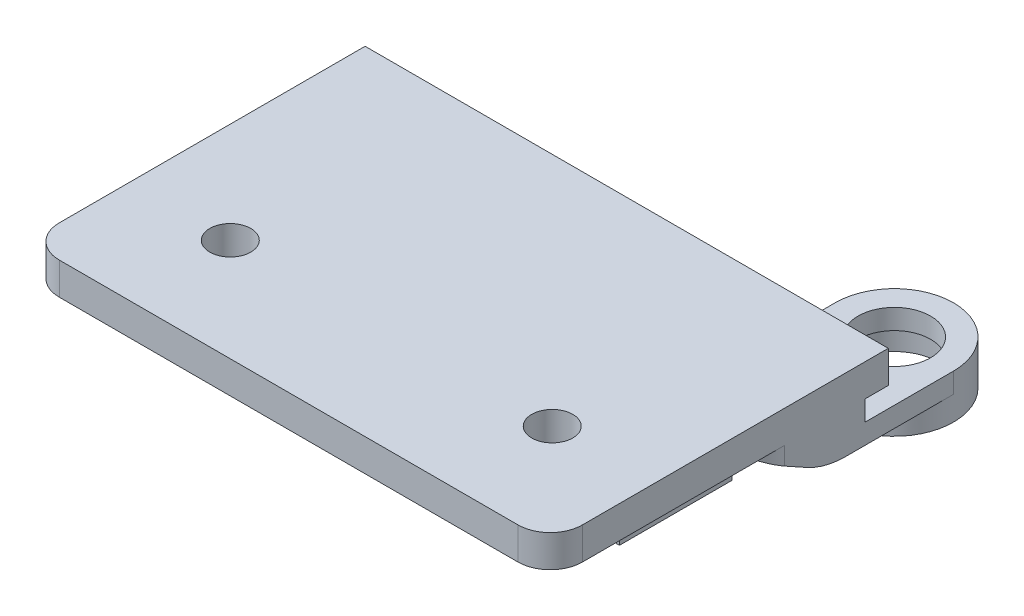
ISO-10303-21;
HEADER;
FILE_DESCRIPTION(('STEP AP214'),'2;1');
FILE_NAME('part.step','',(''),(''),'','','');
FILE_SCHEMA(('AUTOMOTIVE_DESIGN { 1 0 10303 214 1 1 1 1 }'));
ENDSEC;
DATA;
#1=APPLICATION_CONTEXT('core data for automotive mechanical design processes');
#2=APPLICATION_PROTOCOL_DEFINITION('international standard','automotive_design',2000,#1);
#3=PRODUCT_CONTEXT('',#1,'mechanical');
#4=PRODUCT('Part','Part','',(#3));
#5=PRODUCT_RELATED_PRODUCT_CATEGORY('part','',(#4));
#6=PRODUCT_DEFINITION_FORMATION('','',#4);
#7=PRODUCT_DEFINITION_CONTEXT('part definition',#1,'design');
#8=PRODUCT_DEFINITION('design','',#6,#7);
#9=PRODUCT_DEFINITION_SHAPE('','',#8);
#10=(LENGTH_UNIT() NAMED_UNIT(*) SI_UNIT(.MILLI.,.METRE.));
#11=(NAMED_UNIT(*) PLANE_ANGLE_UNIT() SI_UNIT($,.RADIAN.));
#12=(NAMED_UNIT(*) SI_UNIT($,.STERADIAN.) SOLID_ANGLE_UNIT());
#13=UNCERTAINTY_MEASURE_WITH_UNIT(LENGTH_MEASURE(1.E-05),#10,'distance_accuracy_value','');
#14=(GEOMETRIC_REPRESENTATION_CONTEXT(3) GLOBAL_UNCERTAINTY_ASSIGNED_CONTEXT((#13)) GLOBAL_UNIT_ASSIGNED_CONTEXT((#10,
#11,#12)) REPRESENTATION_CONTEXT('',''));
#15=CARTESIAN_POINT('',(0.,0.,0.));
#16=DIRECTION('',(0.,0.,1.));
#17=DIRECTION('',(1.,0.,0.));
#18=AXIS2_PLACEMENT_3D('',#15,#16,#17);
#19=CARTESIAN_POINT('',(45.4999999999992,33.,-32.1043329903239));
#20=DIRECTION('',(0.,-1.,0.));
#21=DIRECTION('',(0.,0.,1.));
#22=AXIS2_PLACEMENT_3D('',#19,#20,#21);
#23=PLANE('',#22);
#24=CARTESIAN_POINT('',(57.6499999999992,33.,-50.1043329903239));
#25=DIRECTION('',(0.,1.,0.));
#26=DIRECTION('',(0.,0.,1.));
#27=AXIS2_PLACEMENT_3D('',#24,#25,#26);
#28=CIRCLE('',#27,4.5);
#29=CARTESIAN_POINT('',(57.6499999999992,33.,-45.6043329903239));
#30=VERTEX_POINT('',#29);
#31=EDGE_CURVE('E1059',#30,#30,#28,.T.);
#32=ORIENTED_EDGE('',*,*,#31,.T.);
#33=EDGE_LOOP('',(#32));
#34=FACE_BOUND('',#33,.T.);
#35=CARTESIAN_POINT('',(57.6499999999992,33.,-50.1043329903239));
#36=DIRECTION('',(0.,1.,0.));
#37=DIRECTION('',(0.,0.,1.));
#38=AXIS2_PLACEMENT_3D('',#35,#36,#37);
#39=CIRCLE('',#38,5.55);
#40=CARTESIAN_POINT('',(57.6499999999992,33.,-44.5543329903239));
#41=VERTEX_POINT('',#40);
#42=EDGE_CURVE('E12',#41,#41,#39,.F.);
#43=ORIENTED_EDGE('',*,*,#42,.T.);
#44=EDGE_LOOP('',(#43));
#45=FACE_BOUND('',#44,.T.);
#46=ADVANCED_FACE('F54',(#34,#45),#23,.T.);
#47=CARTESIAN_POINT('',(20.1111633715986,6.43978022143896,-25.1043329903239));
#48=DIRECTION('',(-1.,0.,0.));
#49=DIRECTION('',(0.,0.,1.));
#50=AXIS2_PLACEMENT_3D('',#47,#48,#49);
#51=PLANE('',#50);
#52=DIRECTION('',(0.,1.,0.));
#53=VECTOR('',#52,1.);
#54=CARTESIAN_POINT('',(20.1111633715986,24.,-30.6043329903239));
#55=LINE('',#54,#53);
#56=CARTESIAN_POINT('',(20.1111633715986,24.,-30.6043329903239));
#57=VERTEX_POINT('',#56);
#58=CARTESIAN_POINT('',(20.1111633715986,28.,-30.6043329903239));
#59=VERTEX_POINT('',#58);
#60=EDGE_CURVE('E389',#57,#59,#55,.T.);
#61=ORIENTED_EDGE('',*,*,#60,.T.);
#62=DIRECTION('',(0.,0.,-1.));
#63=VECTOR('',#62,1.);
#64=CARTESIAN_POINT('',(20.1111633715986,28.,-30.6043329903239));
#65=LINE('',#64,#63);
#66=CARTESIAN_POINT('',(20.1111633715986,28.,-33.6043329903239));
#67=VERTEX_POINT('',#66);
#68=EDGE_CURVE('E401',#59,#67,#65,.T.);
#69=ORIENTED_EDGE('',*,*,#68,.T.);
#70=DIRECTION('',(0.,1.,0.));
#71=VECTOR('',#70,1.);
#72=CARTESIAN_POINT('',(20.1111633715986,24.,-33.6043329903239));
#73=LINE('',#72,#71);
#74=CARTESIAN_POINT('',(20.1111633715986,24.,-33.6043329903239));
#75=VERTEX_POINT('',#74);
#76=EDGE_CURVE('E382',#75,#67,#73,.T.);
#77=ORIENTED_EDGE('',*,*,#76,.F.);
#78=DIRECTION('',(0.,0.,-1.));
#79=VECTOR('',#78,1.);
#80=CARTESIAN_POINT('',(20.1111633715986,24.,-25.1043329903239));
#81=LINE('',#80,#79);
#82=CARTESIAN_POINT('',(20.1111633715986,24.,-39.1043329903239));
#83=VERTEX_POINT('',#82);
#84=EDGE_CURVE('E273',#75,#83,#81,.T.);
#85=ORIENTED_EDGE('',*,*,#84,.T.);
#86=DIRECTION('',(0.,1.,0.));
#87=VECTOR('',#86,1.);
#88=CARTESIAN_POINT('',(20.1111633715986,6.43978022143896,-39.1043329903239));
#89=LINE('',#88,#87);
#90=CARTESIAN_POINT('',(20.1111633715986,38.,-39.1043329903239));
#91=VERTEX_POINT('',#90);
#92=EDGE_CURVE('E282',#83,#91,#89,.T.);
#93=ORIENTED_EDGE('',*,*,#92,.T.);
#94=DIRECTION('',(0.,0.,-1.));
#95=VECTOR('',#94,1.);
#96=CARTESIAN_POINT('',(20.1111633715986,38.,-25.1043329903239));
#97=LINE('',#96,#95);
#98=CARTESIAN_POINT('',(20.1111633715986,38.,-25.1043329903239));
#99=VERTEX_POINT('',#98);
#100=EDGE_CURVE('E283',#99,#91,#97,.T.);
#101=ORIENTED_EDGE('',*,*,#100,.F.);
#102=DIRECTION('',(0.,1.,0.));
#103=VECTOR('',#102,1.);
#104=CARTESIAN_POINT('',(20.1111633715986,6.43978022143896,-25.1043329903239));
#105=LINE('',#104,#103);
#106=CARTESIAN_POINT('',(20.1111633715986,24.,-25.1043329903239));
#107=VERTEX_POINT('',#106);
#108=EDGE_CURVE('E286',#107,#99,#105,.T.);
#109=ORIENTED_EDGE('',*,*,#108,.F.);
#110=EDGE_CURVE('E269',#107,#57,#81,.T.);
#111=ORIENTED_EDGE('',*,*,#110,.T.);
#112=EDGE_LOOP('',(#61,#69,#77,#85,#93,#101,#109,#111));
#113=FACE_BOUND('',#112,.T.);
#114=ADVANCED_FACE('F504',(#113),#51,.F.);
#115=CARTESIAN_POINT('',(71.8178210632764,24.,-25.1043329903239));
#116=DIRECTION('',(0.,-1.,0.));
#117=DIRECTION('',(0.,0.,1.));
#118=AXIS2_PLACEMENT_3D('',#115,#116,#117);
#119=PLANE('',#118);
#120=CARTESIAN_POINT('',(35.4999999999992,24.,-32.1043329903239));
#121=DIRECTION('',(0.,1.,0.));
#122=DIRECTION('',(0.,0.,1.));
#123=AXIS2_PLACEMENT_3D('',#120,#121,#122);
#124=CIRCLE('',#123,2.);
#125=CARTESIAN_POINT('',(35.4999999999992,24.,-30.1043329903239));
#126=VERTEX_POINT('',#125);
#127=EDGE_CURVE('E380',#126,#126,#124,.T.);
#128=ORIENTED_EDGE('',*,*,#127,.F.);
#129=EDGE_LOOP('',(#128));
#130=FACE_BOUND('',#129,.T.);
#131=CARTESIAN_POINT('',(45.4999999999992,24.,-32.1043329903239));
#132=DIRECTION('',(0.,1.,0.));
#133=DIRECTION('',(0.,0.,1.));
#134=AXIS2_PLACEMENT_3D('',#131,#132,#133);
#135=CIRCLE('',#134,2.55);
#136=CARTESIAN_POINT('',(45.4999999999992,24.,-29.5543329903239));
#137=VERTEX_POINT('',#136);
#138=EDGE_CURVE('E268',#137,#137,#135,.F.);
#139=ORIENTED_EDGE('',*,*,#138,.T.);
#140=EDGE_LOOP('',(#139));
#141=FACE_BOUND('',#140,.T.);
#142=DIRECTION('',(-1.,0.,0.));
#143=VECTOR('',#142,1.);
#144=CARTESIAN_POINT('',(24.1111633715986,24.,-30.6043329903239));
#145=LINE('',#144,#143);
#146=CARTESIAN_POINT('',(24.1111633715986,24.,-30.6043329903239));
#147=VERTEX_POINT('',#146);
#148=EDGE_CURVE('E394',#147,#57,#145,.T.);
#149=ORIENTED_EDGE('',*,*,#148,.T.);
#150=ORIENTED_EDGE('',*,*,#110,.F.);
#151=DIRECTION('',(-1.,0.,0.));
#152=VECTOR('',#151,1.);
#153=CARTESIAN_POINT('',(71.8178210632764,24.,-25.1043329903239));
#154=LINE('',#153,#152);
#155=CARTESIAN_POINT('',(48.4999999999992,24.,-25.1043329903239));
#156=VERTEX_POINT('',#155);
#157=EDGE_CURVE('E274',#156,#107,#154,.T.);
#158=ORIENTED_EDGE('',*,*,#157,.F.);
#159=DIRECTION('',(0.,0.,-1.));
#160=VECTOR('',#159,1.);
#161=CARTESIAN_POINT('',(48.4999999999992,24.,-25.1043329903239));
#162=LINE('',#161,#160);
#163=CARTESIAN_POINT('',(48.4999999999992,24.,-39.1043329903239));
#164=VERTEX_POINT('',#163);
#165=EDGE_CURVE('E405',#156,#164,#162,.T.);
#166=ORIENTED_EDGE('',*,*,#165,.T.);
#167=DIRECTION('',(-1.,0.,0.));
#168=VECTOR('',#167,1.);
#169=CARTESIAN_POINT('',(71.8178210632764,24.,-39.1043329903239));
#170=LINE('',#169,#168);
#171=EDGE_CURVE('E272',#164,#83,#170,.T.);
#172=ORIENTED_EDGE('',*,*,#171,.T.);
#173=ORIENTED_EDGE('',*,*,#84,.F.);
#174=DIRECTION('',(-1.,0.,0.));
#175=VECTOR('',#174,1.);
#176=CARTESIAN_POINT('',(24.1111633715986,24.,-33.6043329903239));
#177=LINE('',#176,#175);
#178=CARTESIAN_POINT('',(24.1111633715986,24.,-33.6043329903239));
#179=VERTEX_POINT('',#178);
#180=EDGE_CURVE('E69',#179,#75,#177,.T.);
#181=ORIENTED_EDGE('',*,*,#180,.F.);
#182=DIRECTION('',(0.,0.,-1.));
#183=VECTOR('',#182,1.);
#184=CARTESIAN_POINT('',(24.1111633715986,24.,-30.6043329903239));
#185=LINE('',#184,#183);
#186=EDGE_CURVE('E395',#147,#179,#185,.T.);
#187=ORIENTED_EDGE('',*,*,#186,.F.);
#188=EDGE_LOOP('',(#149,#150,#158,#166,#172,#173,#181,#187));
#189=FACE_BOUND('',#188,.T.);
#190=ADVANCED_FACE('F510',(#130,#141,#189),#119,.F.);
#191=CARTESIAN_POINT('',(4.,38.,-4.));
#192=DIRECTION('',(0.,-1.,0.));
#193=DIRECTION('',(0.,0.,1.));
#194=AXIS2_PLACEMENT_3D('',#191,#192,#193);
#195=PLANE('',#194);
#196=CARTESIAN_POINT('',(35.4999999999992,38.,-32.1043329903239));
#197=DIRECTION('',(0.,1.,0.));
#198=DIRECTION('',(0.,0.,1.));
#199=AXIS2_PLACEMENT_3D('',#196,#197,#198);
#200=CIRCLE('',#199,2.);
#201=CARTESIAN_POINT('',(35.4999999999992,38.,-30.1043329903239));
#202=VERTEX_POINT('',#201);
#203=EDGE_CURVE('E62',#202,#202,#200,.T.);
#204=ORIENTED_EDGE('',*,*,#203,.T.);
#205=EDGE_LOOP('',(#204));
#206=FACE_BOUND('',#205,.T.);
#207=DIRECTION('',(1.,0.,0.));
#208=VECTOR('',#207,1.);
#209=CARTESIAN_POINT('',(16.1111633715986,38.,-25.1043329903239));
#210=LINE('',#209,#208);
#211=CARTESIAN_POINT('',(16.1111633715986,38.,-25.1043329903239));
#212=VERTEX_POINT('',#211);
#213=EDGE_CURVE('E287',#212,#99,#210,.T.);
#214=ORIENTED_EDGE('',*,*,#213,.T.);
#215=ORIENTED_EDGE('',*,*,#100,.T.);
#216=DIRECTION('',(-1.,0.,0.));
#217=VECTOR('',#216,1.);
#218=CARTESIAN_POINT('',(16.1111633715986,38.,-39.1043329903239));
#219=LINE('',#218,#217);
#220=CARTESIAN_POINT('',(16.1111633715986,38.,-39.1043329903239));
#221=VERTEX_POINT('',#220);
#222=EDGE_CURVE('E278',#91,#221,#219,.T.);
#223=ORIENTED_EDGE('',*,*,#222,.T.);
#224=DIRECTION('',(0.,0.,1.));
#225=VECTOR('',#224,1.);
#226=CARTESIAN_POINT('',(16.1111633715986,38.,-25.1043329903239));
#227=LINE('',#226,#225);
#228=EDGE_CURVE('E290',#221,#212,#227,.T.);
#229=ORIENTED_EDGE('',*,*,#228,.T.);
#230=EDGE_LOOP('',(#214,#215,#223,#229));
#231=FACE_BOUND('',#230,.T.);
#232=CARTESIAN_POINT('',(52.5,38.,-12.75));
#233=DIRECTION('',(0.,1.,0.));
#234=DIRECTION('',(0.,0.,1.));
#235=AXIS2_PLACEMENT_3D('',#232,#233,#234);
#236=CIRCLE('',#235,2.55);
#237=CARTESIAN_POINT('',(52.5,38.,-10.2));
#238=VERTEX_POINT('',#237);
#239=EDGE_CURVE('E306',#238,#238,#236,.T.);
#240=ORIENTED_EDGE('',*,*,#239,.T.);
#241=EDGE_LOOP('',(#240));
#242=FACE_BOUND('',#241,.T.);
#243=CARTESIAN_POINT('',(12.5,38.,-12.75));
#244=DIRECTION('',(0.,1.,0.));
#245=DIRECTION('',(0.,0.,1.));
#246=AXIS2_PLACEMENT_3D('',#243,#244,#245);
#247=CIRCLE('',#246,2.55);
#248=CARTESIAN_POINT('',(12.5,38.,-10.2));
#249=VERTEX_POINT('',#248);
#250=EDGE_CURVE('E312',#249,#249,#247,.T.);
#251=ORIENTED_EDGE('',*,*,#250,.T.);
#252=EDGE_LOOP('',(#251));
#253=FACE_BOUND('',#252,.T.);
#254=DIRECTION('',(0.,0.,-1.));
#255=VECTOR('',#254,1.);
#256=CARTESIAN_POINT('',(65.,38.,-4.00000000000003));
#257=LINE('',#256,#255);
#258=CARTESIAN_POINT('',(65.,38.,-39.1043329903239));
#259=VERTEX_POINT('',#258);
#260=CARTESIAN_POINT('',(65.,38.,-42.));
#261=VERTEX_POINT('',#260);
#262=EDGE_CURVE('E322',#259,#261,#257,.T.);
#263=ORIENTED_EDGE('',*,*,#262,.F.);
#264=DIRECTION('',(-1.,0.,0.));
#265=VECTOR('',#264,1.);
#266=CARTESIAN_POINT('',(65.,38.,-39.1043329903239));
#267=LINE('',#266,#265);
#268=CARTESIAN_POINT('',(50.3,38.,-39.1043329903239));
#269=VERTEX_POINT('',#268);
#270=EDGE_CURVE('E246',#259,#269,#267,.T.);
#271=ORIENTED_EDGE('',*,*,#270,.T.);
#272=DIRECTION('',(0.,0.,1.));
#273=VECTOR('',#272,1.);
#274=CARTESIAN_POINT('',(50.3,38.,-29.1043329903239));
#275=LINE('',#274,#273);
#276=CARTESIAN_POINT('',(50.3,38.,-29.1043329903239));
#277=VERTEX_POINT('',#276);
#278=EDGE_CURVE('E258',#269,#277,#275,.T.);
#279=ORIENTED_EDGE('',*,*,#278,.T.);
#280=CARTESIAN_POINT('',(54.3,38.,-29.1043329903239));
#281=DIRECTION('',(0.,1.,0.));
#282=DIRECTION('',(0.,0.,-1.));
#283=AXIS2_PLACEMENT_3D('',#280,#281,#282);
#284=CIRCLE('',#283,4.);
#285=CARTESIAN_POINT('',(54.3,38.,-25.1043329903239));
#286=VERTEX_POINT('',#285);
#287=EDGE_CURVE('E257',#277,#286,#284,.T.);
#288=ORIENTED_EDGE('',*,*,#287,.T.);
#289=DIRECTION('',(1.,0.,0.));
#290=VECTOR('',#289,1.);
#291=CARTESIAN_POINT('',(61.,38.,-25.1043329903239));
#292=LINE('',#291,#290);
#293=CARTESIAN_POINT('',(61.,38.,-25.1043329903239));
#294=VERTEX_POINT('',#293);
#295=EDGE_CURVE('E441',#286,#294,#292,.T.);
#296=ORIENTED_EDGE('',*,*,#295,.T.);
#297=CARTESIAN_POINT('',(61.,38.,-29.1043329903239));
#298=DIRECTION('',(0.,1.,0.));
#299=DIRECTION('',(0.,0.,1.));
#300=AXIS2_PLACEMENT_3D('',#297,#298,#299);
#301=CIRCLE('',#300,4.);
#302=CARTESIAN_POINT('',(65.,38.,-29.104332990324));
#303=VERTEX_POINT('',#302);
#304=EDGE_CURVE('E261',#294,#303,#301,.T.);
#305=ORIENTED_EDGE('',*,*,#304,.T.);
#306=CARTESIAN_POINT('',(65.,38.,-4.00000000000003));
#307=VERTEX_POINT('',#306);
#308=EDGE_CURVE('E318',#307,#303,#257,.T.);
#309=ORIENTED_EDGE('',*,*,#308,.F.);
#310=CARTESIAN_POINT('',(61.,38.,-4.));
#311=DIRECTION('',(0.,1.,0.));
#312=DIRECTION('',(0.,0.,-1.));
#313=AXIS2_PLACEMENT_3D('',#310,#311,#312);
#314=CIRCLE('',#313,4.);
#315=CARTESIAN_POINT('',(61.,38.,0.));
#316=VERTEX_POINT('',#315);
#317=EDGE_CURVE('E331',#316,#307,#314,.T.);
#318=ORIENTED_EDGE('',*,*,#317,.F.);
#319=DIRECTION('',(1.,0.,0.));
#320=VECTOR('',#319,1.);
#321=CARTESIAN_POINT('',(4.00000000000003,38.,0.));
#322=LINE('',#321,#320);
#323=CARTESIAN_POINT('',(4.,38.,0.));
#324=VERTEX_POINT('',#323);
#325=EDGE_CURVE('E328',#324,#316,#322,.T.);
#326=ORIENTED_EDGE('',*,*,#325,.F.);
#327=CARTESIAN_POINT('',(4.,38.,-4.));
#328=DIRECTION('',(0.,1.,0.));
#329=DIRECTION('',(0.,0.,1.));
#330=AXIS2_PLACEMENT_3D('',#327,#328,#329);
#331=CIRCLE('',#330,4.);
#332=CARTESIAN_POINT('',(0.,38.,-4.00000000000003));
#333=VERTEX_POINT('',#332);
#334=EDGE_CURVE('E325',#333,#324,#331,.T.);
#335=ORIENTED_EDGE('',*,*,#334,.F.);
#336=DIRECTION('',(0.,0.,1.));
#337=VECTOR('',#336,1.);
#338=CARTESIAN_POINT('',(0.,38.,-4.00000000000003));
#339=LINE('',#338,#337);
#340=CARTESIAN_POINT('',(0.,38.,-42.));
#341=VERTEX_POINT('',#340);
#342=EDGE_CURVE('E321',#341,#333,#339,.T.);
#343=ORIENTED_EDGE('',*,*,#342,.F.);
#344=DIRECTION('',(-1.,0.,0.));
#345=VECTOR('',#344,1.);
#346=CARTESIAN_POINT('',(4.,38.,-42.));
#347=LINE('',#346,#345);
#348=EDGE_CURVE('E417',#261,#341,#347,.T.);
#349=ORIENTED_EDGE('',*,*,#348,.F.);
#350=EDGE_LOOP('',(#263,#271,#279,#288,#296,#305,#309,#318,#326,#335,#343,#349));
#351=FACE_BOUND('',#350,.T.);
#352=ADVANCED_FACE('F369',(#206,#231,#242,#253,#351),#195,.T.);
#353=CARTESIAN_POINT('',(65.,38.,-4.00000000000003));
#354=DIRECTION('',(-1.,0.,0.));
#355=DIRECTION('',(0.,0.,1.));
#356=AXIS2_PLACEMENT_3D('',#353,#354,#355);
#357=PLANE('',#356);
#358=DIRECTION('',(0.,-1.,0.));
#359=VECTOR('',#358,1.);
#360=CARTESIAN_POINT('',(65.,42.,-42.));
#361=LINE('',#360,#359);
#362=CARTESIAN_POINT('',(65.,42.,-42.));
#363=VERTEX_POINT('',#362);
#364=EDGE_CURVE('E408',#363,#261,#361,.T.);
#365=ORIENTED_EDGE('',*,*,#364,.F.);
#366=DIRECTION('',(0.,0.,-1.));
#367=VECTOR('',#366,1.);
#368=CARTESIAN_POINT('',(65.,42.,-4.00000000000003));
#369=LINE('',#368,#367);
#370=CARTESIAN_POINT('',(65.,42.,-4.00000000000003));
#371=VERTEX_POINT('',#370);
#372=EDGE_CURVE('E315',#371,#363,#369,.T.);
#373=ORIENTED_EDGE('',*,*,#372,.F.);
#374=DIRECTION('',(0.,1.,0.));
#375=VECTOR('',#374,1.);
#376=CARTESIAN_POINT('',(65.,38.,-4.00000000000003));
#377=LINE('',#376,#375);
#378=EDGE_CURVE('E334',#307,#371,#377,.T.);
#379=ORIENTED_EDGE('',*,*,#378,.F.);
#380=ORIENTED_EDGE('',*,*,#308,.T.);
#381=DIRECTION('',(0.,1.,0.));
#382=VECTOR('',#381,1.);
#383=CARTESIAN_POINT('',(65.,12.7,-29.104332990324));
#384=LINE('',#383,#382);
#385=CARTESIAN_POINT('',(65.,35.7777777777778,-29.1043329903239));
#386=VERTEX_POINT('',#385);
#387=EDGE_CURVE('E259',#386,#303,#384,.T.);
#388=ORIENTED_EDGE('',*,*,#387,.F.);
#389=DIRECTION('',(0.,-0.485642931178632,-0.874157276121538));
#390=VECTOR('',#389,1.);
#391=CARTESIAN_POINT('',(65.,49.6008960807979,-4.22272004488771));
#392=LINE('',#391,#390);
#393=CARTESIAN_POINT('',(65.,34.2584272387846,-31.8391639605116));
#394=VERTEX_POINT('',#393);
#395=EDGE_CURVE('E430',#386,#394,#392,.T.);
#396=ORIENTED_EDGE('',*,*,#395,.T.);
#397=CARTESIAN_POINT('',(65.,43.,-36.6955932722979));
#398=DIRECTION('',(1.,0.,0.));
#399=DIRECTION('',(0.,0.,1.));
#400=AXIS2_PLACEMENT_3D('',#397,#398,#399);
#401=CIRCLE('',#400,10.);
#402=CARTESIAN_POINT('',(65.,33.,-36.6955932722979));
#403=VERTEX_POINT('',#402);
#404=EDGE_CURVE('E360',#403,#394,#401,.F.);
#405=ORIENTED_EDGE('',*,*,#404,.F.);
#406=DIRECTION('',(0.,0.,-1.));
#407=VECTOR('',#406,1.);
#408=CARTESIAN_POINT('',(65.,33.,-29.104332990324));
#409=LINE('',#408,#407);
#410=CARTESIAN_POINT('',(65.,33.,-50.1043329903239));
#411=VERTEX_POINT('',#410);
#412=EDGE_CURVE('E245',#403,#411,#409,.T.);
#413=ORIENTED_EDGE('',*,*,#412,.T.);
#414=DIRECTION('',(0.,-1.,0.));
#415=VECTOR('',#414,1.);
#416=CARTESIAN_POINT('',(65.,35.5,-50.1043329903239));
#417=LINE('',#416,#415);
#418=CARTESIAN_POINT('',(65.,35.5,-50.1043329903239));
#419=VERTEX_POINT('',#418);
#420=EDGE_CURVE('E229',#419,#411,#417,.T.);
#421=ORIENTED_EDGE('',*,*,#420,.F.);
#422=DIRECTION('',(0.,0.,-1.));
#423=VECTOR('',#422,1.);
#424=CARTESIAN_POINT('',(65.,35.5,0.));
#425=LINE('',#424,#423);
#426=CARTESIAN_POINT('',(65.,35.5,-39.1043329903239));
#427=VERTEX_POINT('',#426);
#428=EDGE_CURVE('E230',#427,#419,#425,.T.);
#429=ORIENTED_EDGE('',*,*,#428,.F.);
#430=DIRECTION('',(0.,1.,0.));
#431=VECTOR('',#430,1.);
#432=CARTESIAN_POINT('',(65.,12.7,-39.1043329903239));
#433=LINE('',#432,#431);
#434=EDGE_CURVE('E251',#427,#259,#433,.T.);
#435=ORIENTED_EDGE('',*,*,#434,.T.);
#436=ORIENTED_EDGE('',*,*,#262,.T.);
#437=EDGE_LOOP('',(#365,#373,#379,#380,#388,#396,#405,#413,#421,#429,#435,#436));
#438=FACE_BOUND('',#437,.T.);
#439=ADVANCED_FACE('F468',(#438),#357,.F.);
#440=CARTESIAN_POINT('',(0.,38.,-4.00000000000003));
#441=DIRECTION('',(1.,0.,0.));
#442=DIRECTION('',(0.,0.,-1.));
#443=AXIS2_PLACEMENT_3D('',#440,#441,#442);
#444=PLANE('',#443);
#445=DIRECTION('',(0.,1.,0.));
#446=VECTOR('',#445,1.);
#447=CARTESIAN_POINT('',(0.,42.,-42.));
#448=LINE('',#447,#446);
#449=CARTESIAN_POINT('',(0.,42.,-42.));
#450=VERTEX_POINT('',#449);
#451=EDGE_CURVE('E414',#341,#450,#448,.T.);
#452=ORIENTED_EDGE('',*,*,#451,.F.);
#453=ORIENTED_EDGE('',*,*,#342,.T.);
#454=DIRECTION('',(0.,1.,0.));
#455=VECTOR('',#454,1.);
#456=CARTESIAN_POINT('',(0.,38.,-4.00000000000003));
#457=LINE('',#456,#455);
#458=CARTESIAN_POINT('',(0.,42.,-4.00000000000003));
#459=VERTEX_POINT('',#458);
#460=EDGE_CURVE('E354',#333,#459,#457,.T.);
#461=ORIENTED_EDGE('',*,*,#460,.T.);
#462=DIRECTION('',(0.,0.,1.));
#463=VECTOR('',#462,1.);
#464=CARTESIAN_POINT('',(0.,42.,-4.00000000000003));
#465=LINE('',#464,#463);
#466=EDGE_CURVE('E337',#450,#459,#465,.T.);
#467=ORIENTED_EDGE('',*,*,#466,.F.);
#468=EDGE_LOOP('',(#452,#453,#461,#467));
#469=FACE_BOUND('',#468,.T.);
#470=ADVANCED_FACE('F483',(#469),#444,.F.);
#471=CARTESIAN_POINT('',(4.,42.,-4.));
#472=DIRECTION('',(0.,-1.,0.));
#473=DIRECTION('',(0.,0.,1.));
#474=AXIS2_PLACEMENT_3D('',#471,#472,#473);
#475=PLANE('',#474);
#476=CARTESIAN_POINT('',(52.5,42.,-12.75));
#477=DIRECTION('',(0.,1.,0.));
#478=DIRECTION('',(0.,0.,1.));
#479=AXIS2_PLACEMENT_3D('',#476,#477,#478);
#480=CIRCLE('',#479,2.55);
#481=CARTESIAN_POINT('',(52.5,42.,-10.2));
#482=VERTEX_POINT('',#481);
#483=EDGE_CURVE('E295',#482,#482,#480,.T.);
#484=ORIENTED_EDGE('',*,*,#483,.F.);
#485=EDGE_LOOP('',(#484));
#486=FACE_BOUND('',#485,.T.);
#487=CARTESIAN_POINT('',(12.5,42.,-12.75));
#488=DIRECTION('',(0.,1.,0.));
#489=DIRECTION('',(0.,0.,1.));
#490=AXIS2_PLACEMENT_3D('',#487,#488,#489);
#491=CIRCLE('',#490,2.55);
#492=CARTESIAN_POINT('',(12.5,42.,-10.2));
#493=VERTEX_POINT('',#492);
#494=EDGE_CURVE('E309',#493,#493,#491,.T.);
#495=ORIENTED_EDGE('',*,*,#494,.F.);
#496=EDGE_LOOP('',(#495));
#497=FACE_BOUND('',#496,.T.);
#498=DIRECTION('',(1.,0.,0.));
#499=VECTOR('',#498,1.);
#500=CARTESIAN_POINT('',(-21.0297408448131,42.,-42.));
#501=LINE('',#500,#499);
#502=EDGE_CURVE('E418',#450,#363,#501,.T.);
#503=ORIENTED_EDGE('',*,*,#502,.F.);
#504=ORIENTED_EDGE('',*,*,#466,.T.);
#505=CARTESIAN_POINT('',(4.,42.,-4.));
#506=DIRECTION('',(0.,1.,0.));
#507=DIRECTION('',(0.,0.,1.));
#508=AXIS2_PLACEMENT_3D('',#505,#506,#507);
#509=CIRCLE('',#508,4.);
#510=CARTESIAN_POINT('',(4.,42.,0.));
#511=VERTEX_POINT('',#510);
#512=EDGE_CURVE('E340',#459,#511,#509,.T.);
#513=ORIENTED_EDGE('',*,*,#512,.T.);
#514=DIRECTION('',(1.,0.,0.));
#515=VECTOR('',#514,1.);
#516=CARTESIAN_POINT('',(4.00000000000003,42.,0.));
#517=LINE('',#516,#515);
#518=CARTESIAN_POINT('',(61.,42.,0.));
#519=VERTEX_POINT('',#518);
#520=EDGE_CURVE('E343',#511,#519,#517,.T.);
#521=ORIENTED_EDGE('',*,*,#520,.T.);
#522=CARTESIAN_POINT('',(61.,42.,-4.));
#523=DIRECTION('',(0.,1.,0.));
#524=DIRECTION('',(0.,0.,-1.));
#525=AXIS2_PLACEMENT_3D('',#522,#523,#524);
#526=CIRCLE('',#525,4.);
#527=EDGE_CURVE('E346',#519,#371,#526,.T.);
#528=ORIENTED_EDGE('',*,*,#527,.T.);
#529=ORIENTED_EDGE('',*,*,#372,.T.);
#530=EDGE_LOOP('',(#503,#504,#513,#521,#528,#529));
#531=FACE_BOUND('',#530,.T.);
#532=ADVANCED_FACE('F539',(#486,#497,#531),#475,.F.);
#533=CARTESIAN_POINT('',(65.,12.7,-39.1043329903239));
#534=DIRECTION('',(0.,0.,1.));
#535=DIRECTION('',(1.,0.,0.));
#536=AXIS2_PLACEMENT_3D('',#533,#534,#535);
#537=PLANE('',#536);
#538=DIRECTION('',(1.,0.,0.));
#539=VECTOR('',#538,1.);
#540=CARTESIAN_POINT('',(0.,35.5,-39.1043329903239));
#541=LINE('',#540,#539);
#542=CARTESIAN_POINT('',(50.2999999999983,35.5,-39.1043329903239));
#543=VERTEX_POINT('',#542);
#544=EDGE_CURVE('E426',#543,#427,#541,.T.);
#545=ORIENTED_EDGE('',*,*,#544,.F.);
#546=DIRECTION('',(0.,1.,0.));
#547=VECTOR('',#546,1.);
#548=CARTESIAN_POINT('',(50.3,12.7,-39.1043329903239));
#549=LINE('',#548,#547);
#550=EDGE_CURVE('E263',#543,#269,#549,.T.);
#551=ORIENTED_EDGE('',*,*,#550,.T.);
#552=ORIENTED_EDGE('',*,*,#270,.F.);
#553=ORIENTED_EDGE('',*,*,#434,.F.);
#554=EDGE_LOOP('',(#545,#551,#552,#553));
#555=FACE_BOUND('',#554,.T.);
#556=ADVANCED_FACE('F490',(#555),#537,.F.);
#557=CARTESIAN_POINT('',(4.,38.,-4.));
#558=DIRECTION('',(0.,1.,0.));
#559=DIRECTION('',(0.,0.,-1.));
#560=AXIS2_PLACEMENT_3D('',#557,#558,#559);
#561=CYLINDRICAL_SURFACE('',#560,4.);
#562=ORIENTED_EDGE('',*,*,#512,.F.);
#563=ORIENTED_EDGE('',*,*,#460,.F.);
#564=ORIENTED_EDGE('',*,*,#334,.T.);
#565=DIRECTION('',(0.,1.,0.));
#566=VECTOR('',#565,1.);
#567=CARTESIAN_POINT('',(4.,38.,0.));
#568=LINE('',#567,#566);
#569=EDGE_CURVE('E352',#324,#511,#568,.T.);
#570=ORIENTED_EDGE('',*,*,#569,.T.);
#571=EDGE_LOOP('',(#562,#563,#564,#570));
#572=FACE_BOUND('',#571,.T.);
#573=ADVANCED_FACE('F480',(#572),#561,.T.);
#574=CARTESIAN_POINT('',(4.00000000000003,38.,0.));
#575=DIRECTION('',(0.,0.,-1.));
#576=DIRECTION('',(-1.,0.,0.));
#577=AXIS2_PLACEMENT_3D('',#574,#575,#576);
#578=PLANE('',#577);
#579=DIRECTION('',(0.,1.,0.));
#580=VECTOR('',#579,1.);
#581=CARTESIAN_POINT('',(61.,38.,0.));
#582=LINE('',#581,#580);
#583=EDGE_CURVE('E350',#316,#519,#582,.T.);
#584=ORIENTED_EDGE('',*,*,#583,.T.);
#585=ORIENTED_EDGE('',*,*,#520,.F.);
#586=ORIENTED_EDGE('',*,*,#569,.F.);
#587=ORIENTED_EDGE('',*,*,#325,.T.);
#588=EDGE_LOOP('',(#584,#585,#586,#587));
#589=FACE_BOUND('',#588,.T.);
#590=ADVANCED_FACE('F477',(#589),#578,.F.);
#591=CARTESIAN_POINT('',(61.,38.,-4.));
#592=DIRECTION('',(0.,1.,0.));
#593=DIRECTION('',(0.,0.,-1.));
#594=AXIS2_PLACEMENT_3D('',#591,#592,#593);
#595=CYLINDRICAL_SURFACE('',#594,4.);
#596=ORIENTED_EDGE('',*,*,#527,.F.);
#597=ORIENTED_EDGE('',*,*,#583,.F.);
#598=ORIENTED_EDGE('',*,*,#317,.T.);
#599=ORIENTED_EDGE('',*,*,#378,.T.);
#600=EDGE_LOOP('',(#596,#597,#598,#599));
#601=FACE_BOUND('',#600,.T.);
#602=ADVANCED_FACE('F472',(#601),#595,.T.);
#603=CARTESIAN_POINT('',(12.5,38.,-12.75));
#604=DIRECTION('',(0.,1.,0.));
#605=DIRECTION('',(0.,0.,-1.));
#606=AXIS2_PLACEMENT_3D('',#603,#604,#605);
#607=CYLINDRICAL_SURFACE('',#606,2.55);
#608=ORIENTED_EDGE('',*,*,#250,.F.);
#609=EDGE_LOOP('',(#608));
#610=FACE_BOUND('',#609,.T.);
#611=ORIENTED_EDGE('',*,*,#494,.T.);
#612=EDGE_LOOP('',(#611));
#613=FACE_BOUND('',#612,.T.);
#614=ADVANCED_FACE('F527',(#610,#613),#607,.F.);
#615=CARTESIAN_POINT('',(52.5,38.,-12.75));
#616=DIRECTION('',(0.,1.,0.));
#617=DIRECTION('',(0.,0.,-1.));
#618=AXIS2_PLACEMENT_3D('',#615,#616,#617);
#619=CYLINDRICAL_SURFACE('',#618,2.55);
#620=ORIENTED_EDGE('',*,*,#239,.F.);
#621=EDGE_LOOP('',(#620));
#622=FACE_BOUND('',#621,.T.);
#623=ORIENTED_EDGE('',*,*,#483,.T.);
#624=EDGE_LOOP('',(#623));
#625=FACE_BOUND('',#624,.T.);
#626=ADVANCED_FACE('F519',(#622,#625),#619,.F.);
#627=ORIENTED_EDGE('',*,*,#412,.F.);
#628=DIRECTION('',(1.,0.,0.));
#629=VECTOR('',#628,1.);
#630=CARTESIAN_POINT('',(65.,33.,-36.6955932722979));
#631=LINE('',#630,#629);
#632=CARTESIAN_POINT('',(50.3,33.,-36.6955932722979));
#633=VERTEX_POINT('',#632);
#634=EDGE_CURVE('E244',#633,#403,#631,.T.);
#635=ORIENTED_EDGE('',*,*,#634,.F.);
#636=DIRECTION('',(0.,0.,1.));
#637=VECTOR('',#636,1.);
#638=CARTESIAN_POINT('',(50.3,33.,-29.1043329903239));
#639=LINE('',#638,#637);
#640=CARTESIAN_POINT('',(50.2999999999983,33.,-50.1043329903239));
#641=VERTEX_POINT('',#640);
#642=EDGE_CURVE('E224',#641,#633,#639,.T.);
#643=ORIENTED_EDGE('',*,*,#642,.F.);
#644=CARTESIAN_POINT('',(57.6499999999992,33.,-50.1043329903239));
#645=DIRECTION('',(0.,1.,0.));
#646=DIRECTION('',(0.,0.,1.));
#647=AXIS2_PLACEMENT_3D('',#644,#645,#646);
#648=CIRCLE('',#647,7.35000000000085);
#649=EDGE_CURVE('E233',#641,#411,#648,.T.);
#650=ORIENTED_EDGE('',*,*,#649,.T.);
#651=EDGE_LOOP('',(#627,#635,#643,#650));
#652=FACE_BOUND('',#651,.T.);
#653=ADVANCED_FACE('F243',(#652),#23,.T.);
#654=CARTESIAN_POINT('',(16.1111633715986,6.43978022143896,-25.1043329903239));
#655=DIRECTION('',(1.,0.,0.));
#656=DIRECTION('',(0.,0.,-1.));
#657=AXIS2_PLACEMENT_3D('',#654,#655,#656);
#658=PLANE('',#657);
#659=DIRECTION('',(0.,0.,1.));
#660=VECTOR('',#659,1.);
#661=CARTESIAN_POINT('',(16.1111633715986,21.,-25.1043329903239));
#662=LINE('',#661,#660);
#663=CARTESIAN_POINT('',(16.1111633715986,21.,-39.1043329903239));
#664=VERTEX_POINT('',#663);
#665=CARTESIAN_POINT('',(16.1111633715986,21.,-25.1043329903239));
#666=VERTEX_POINT('',#665);
#667=EDGE_CURVE('E296',#664,#666,#662,.T.);
#668=ORIENTED_EDGE('',*,*,#667,.T.);
#669=DIRECTION('',(0.,1.,0.));
#670=VECTOR('',#669,1.);
#671=CARTESIAN_POINT('',(16.1111633715986,6.43978022143896,-25.1043329903239));
#672=LINE('',#671,#670);
#673=EDGE_CURVE('E289',#666,#212,#672,.T.);
#674=ORIENTED_EDGE('',*,*,#673,.T.);
#675=ORIENTED_EDGE('',*,*,#228,.F.);
#676=DIRECTION('',(0.,1.,0.));
#677=VECTOR('',#676,1.);
#678=CARTESIAN_POINT('',(16.1111633715986,6.43978022143896,-39.1043329903239));
#679=LINE('',#678,#677);
#680=EDGE_CURVE('E277',#664,#221,#679,.T.);
#681=ORIENTED_EDGE('',*,*,#680,.F.);
#682=EDGE_LOOP('',(#668,#674,#675,#681));
#683=FACE_BOUND('',#682,.T.);
#684=ADVANCED_FACE('F518',(#683),#658,.F.);
#685=CARTESIAN_POINT('',(16.1111633715986,6.43978022143896,-25.1043329903239));
#686=DIRECTION('',(0.,0.,-1.));
#687=DIRECTION('',(-1.,0.,0.));
#688=AXIS2_PLACEMENT_3D('',#685,#686,#687);
#689=PLANE('',#688);
#690=ORIENTED_EDGE('',*,*,#157,.T.);
#691=ORIENTED_EDGE('',*,*,#108,.T.);
#692=ORIENTED_EDGE('',*,*,#213,.F.);
#693=ORIENTED_EDGE('',*,*,#673,.F.);
#694=DIRECTION('',(1.,0.,0.));
#695=VECTOR('',#694,1.);
#696=CARTESIAN_POINT('',(16.1111633715986,21.,-25.1043329903239));
#697=LINE('',#696,#695);
#698=CARTESIAN_POINT('',(48.4999999999992,21.,-25.1043329903239));
#699=VERTEX_POINT('',#698);
#700=EDGE_CURVE('E293',#666,#699,#697,.T.);
#701=ORIENTED_EDGE('',*,*,#700,.T.);
#702=DIRECTION('',(0.,-1.,0.));
#703=VECTOR('',#702,1.);
#704=CARTESIAN_POINT('',(48.4999999999992,40.6433169770937,-25.1043329903239));
#705=LINE('',#704,#703);
#706=EDGE_CURVE('E77',#156,#699,#705,.T.);
#707=ORIENTED_EDGE('',*,*,#706,.F.);
#708=EDGE_LOOP('',(#690,#691,#692,#693,#701,#707));
#709=FACE_BOUND('',#708,.T.);
#710=ADVANCED_FACE('F524',(#709),#689,.F.);
#711=CARTESIAN_POINT('',(16.1111633715986,6.43978022143896,-39.1043329903239));
#712=DIRECTION('',(0.,0.,1.));
#713=DIRECTION('',(1.,0.,0.));
#714=AXIS2_PLACEMENT_3D('',#711,#712,#713);
#715=PLANE('',#714);
#716=DIRECTION('',(-1.,0.,0.));
#717=VECTOR('',#716,1.);
#718=CARTESIAN_POINT('',(16.1111633715986,21.,-39.1043329903239));
#719=LINE('',#718,#717);
#720=CARTESIAN_POINT('',(48.4999999999992,21.,-39.1043329903239));
#721=VERTEX_POINT('',#720);
#722=EDGE_CURVE('E281',#721,#664,#719,.T.);
#723=ORIENTED_EDGE('',*,*,#722,.T.);
#724=ORIENTED_EDGE('',*,*,#680,.T.);
#725=ORIENTED_EDGE('',*,*,#222,.F.);
#726=ORIENTED_EDGE('',*,*,#92,.F.);
#727=ORIENTED_EDGE('',*,*,#171,.F.);
#728=DIRECTION('',(0.,-1.,0.));
#729=VECTOR('',#728,1.);
#730=CARTESIAN_POINT('',(48.4999999999992,40.6433169770937,-39.1043329903239));
#731=LINE('',#730,#729);
#732=EDGE_CURVE('E409',#164,#721,#731,.T.);
#733=ORIENTED_EDGE('',*,*,#732,.T.);
#734=EDGE_LOOP('',(#723,#724,#725,#726,#727,#733));
#735=FACE_BOUND('',#734,.T.);
#736=ADVANCED_FACE('F611',(#735),#715,.F.);
#737=CARTESIAN_POINT('',(4.,21.,-4.));
#738=DIRECTION('',(0.,-1.,0.));
#739=DIRECTION('',(0.,0.,1.));
#740=AXIS2_PLACEMENT_3D('',#737,#738,#739);
#741=PLANE('',#740);
#742=DIRECTION('',(0.,0.,1.));
#743=VECTOR('',#742,1.);
#744=CARTESIAN_POINT('',(48.4999999999992,21.,-25.1043329903239));
#745=LINE('',#744,#743);
#746=EDGE_CURVE('E404',#721,#699,#745,.T.);
#747=ORIENTED_EDGE('',*,*,#746,.T.);
#748=ORIENTED_EDGE('',*,*,#700,.F.);
#749=ORIENTED_EDGE('',*,*,#667,.F.);
#750=ORIENTED_EDGE('',*,*,#722,.F.);
#751=EDGE_LOOP('',(#747,#748,#749,#750));
#752=FACE_BOUND('',#751,.T.);
#753=CARTESIAN_POINT('',(45.4999999999992,21.,-32.1043329903239));
#754=DIRECTION('',(0.,1.,0.));
#755=DIRECTION('',(0.,0.,1.));
#756=AXIS2_PLACEMENT_3D('',#753,#754,#755);
#757=CIRCLE('',#756,2.55);
#758=CARTESIAN_POINT('',(45.4999999999992,21.,-29.5543329903239));
#759=VERTEX_POINT('',#758);
#760=EDGE_CURVE('E248',#759,#759,#757,.T.);
#761=ORIENTED_EDGE('',*,*,#760,.T.);
#762=EDGE_LOOP('',(#761));
#763=FACE_BOUND('',#762,.T.);
#764=ADVANCED_FACE('F621',(#752,#763),#741,.T.);
#765=CARTESIAN_POINT('',(45.4999999999992,13.7875108318972,-32.1043329903239));
#766=DIRECTION('',(0.,1.,0.));
#767=DIRECTION('',(0.,0.,-1.));
#768=AXIS2_PLACEMENT_3D('',#765,#766,#767);
#769=CYLINDRICAL_SURFACE('',#768,2.55);
#770=ORIENTED_EDGE('',*,*,#760,.F.);
#771=EDGE_LOOP('',(#770));
#772=FACE_BOUND('',#771,.T.);
#773=ORIENTED_EDGE('',*,*,#138,.F.);
#774=EDGE_LOOP('',(#773));
#775=FACE_BOUND('',#774,.T.);
#776=ADVANCED_FACE('F633',(#772,#775),#769,.F.);
#777=CARTESIAN_POINT('',(50.3,12.7,-29.1043329903239));
#778=DIRECTION('',(1.,0.,0.));
#779=DIRECTION('',(0.,0.,-1.));
#780=AXIS2_PLACEMENT_3D('',#777,#778,#779);
#781=PLANE('',#780);
#782=DIRECTION('',(0.,0.485642931178632,0.874157276121538));
#783=VECTOR('',#782,1.);
#784=CARTESIAN_POINT('',(50.3,49.6008960807979,-4.22272004488772));
#785=LINE('',#784,#783);
#786=CARTESIAN_POINT('',(50.3,34.2584272387846,-31.8391639605116));
#787=VERTEX_POINT('',#786);
#788=CARTESIAN_POINT('',(50.3,35.7777777777778,-29.104332990324));
#789=VERTEX_POINT('',#788);
#790=EDGE_CURVE('E432',#787,#789,#785,.T.);
#791=ORIENTED_EDGE('',*,*,#790,.T.);
#792=DIRECTION('',(0.,1.,0.));
#793=VECTOR('',#792,1.);
#794=CARTESIAN_POINT('',(50.3,12.7,-29.1043329903239));
#795=LINE('',#794,#793);
#796=EDGE_CURVE('E255',#789,#277,#795,.T.);
#797=ORIENTED_EDGE('',*,*,#796,.T.);
#798=ORIENTED_EDGE('',*,*,#278,.F.);
#799=ORIENTED_EDGE('',*,*,#550,.F.);
#800=DIRECTION('',(0.,0.,1.));
#801=VECTOR('',#800,1.);
#802=CARTESIAN_POINT('',(50.2999999999983,35.5,0.));
#803=LINE('',#802,#801);
#804=CARTESIAN_POINT('',(50.2999999999983,35.5,-50.1043329903239));
#805=VERTEX_POINT('',#804);
#806=EDGE_CURVE('E227',#805,#543,#803,.T.);
#807=ORIENTED_EDGE('',*,*,#806,.F.);
#808=DIRECTION('',(0.,-1.,0.));
#809=VECTOR('',#808,1.);
#810=CARTESIAN_POINT('',(50.2999999999983,35.5,-50.1043329903239));
#811=LINE('',#810,#809);
#812=EDGE_CURVE('E218',#805,#641,#811,.T.);
#813=ORIENTED_EDGE('',*,*,#812,.T.);
#814=ORIENTED_EDGE('',*,*,#642,.T.);
#815=CARTESIAN_POINT('',(50.3,43.,-36.695593272298));
#816=DIRECTION('',(-1.,0.,0.));
#817=DIRECTION('',(0.,0.,-1.));
#818=AXIS2_PLACEMENT_3D('',#815,#816,#817);
#819=CIRCLE('',#818,10.);
#820=EDGE_CURVE('E365',#787,#633,#819,.F.);
#821=ORIENTED_EDGE('',*,*,#820,.F.);
#822=EDGE_LOOP('',(#791,#797,#798,#799,#807,#813,#814,#821));
#823=FACE_BOUND('',#822,.T.);
#824=ADVANCED_FACE('F221',(#823),#781,.F.);
#825=CARTESIAN_POINT('',(54.3,12.7,-29.1043329903239));
#826=DIRECTION('',(0.,1.,0.));
#827=DIRECTION('',(0.,0.,-1.));
#828=AXIS2_PLACEMENT_3D('',#825,#826,#827);
#829=CYLINDRICAL_SURFACE('',#828,4.);
#830=ORIENTED_EDGE('',*,*,#287,.F.);
#831=ORIENTED_EDGE('',*,*,#796,.F.);
#832=CARTESIAN_POINT('',(54.3,35.7777777777778,-29.1043329903239));
#833=DIRECTION('',(0.,-0.874157276121538,0.485642931178632));
#834=DIRECTION('',(0.,0.485642931178632,0.874157276121538));
#835=AXIS2_PLACEMENT_3D('',#832,#833,#834);
#836=ELLIPSE('',#835,4.57583561821644,4.);
#837=EDGE_CURVE('E265',#286,#789,#836,.T.);
#838=ORIENTED_EDGE('',*,*,#837,.F.);
#839=EDGE_LOOP('',(#830,#831,#838));
#840=FACE_BOUND('',#839,.T.);
#841=ADVANCED_FACE('F455',(#840),#829,.T.);
#842=CARTESIAN_POINT('',(61.,12.7,-29.1043329903239));
#843=DIRECTION('',(0.,1.,0.));
#844=DIRECTION('',(0.,0.,-1.));
#845=AXIS2_PLACEMENT_3D('',#842,#843,#844);
#846=CYLINDRICAL_SURFACE('',#845,4.);
#847=ORIENTED_EDGE('',*,*,#387,.T.);
#848=ORIENTED_EDGE('',*,*,#304,.F.);
#849=CARTESIAN_POINT('',(61.,35.7777777777778,-29.1043329903239));
#850=DIRECTION('',(0.,-0.874157276121538,0.485642931178632));
#851=DIRECTION('',(0.,0.485642931178632,0.874157276121538));
#852=AXIS2_PLACEMENT_3D('',#849,#850,#851);
#853=ELLIPSE('',#852,4.57583561821645,4.);
#854=EDGE_CURVE('E434',#386,#294,#853,.T.);
#855=ORIENTED_EDGE('',*,*,#854,.F.);
#856=EDGE_LOOP('',(#847,#848,#855));
#857=FACE_BOUND('',#856,.T.);
#858=ADVANCED_FACE('F464',(#857),#846,.T.);
#859=CARTESIAN_POINT('',(40.004369859013,49.6008960807979,-4.22272004488773));
#860=DIRECTION('',(0.,0.874157276121538,-0.485642931178632));
#861=DIRECTION('',(0.,-0.485642931178632,-0.874157276121538));
#862=AXIS2_PLACEMENT_3D('',#859,#860,#861);
#863=PLANE('',#862);
#864=ORIENTED_EDGE('',*,*,#395,.F.);
#865=ORIENTED_EDGE('',*,*,#854,.T.);
#866=ORIENTED_EDGE('',*,*,#295,.F.);
#867=ORIENTED_EDGE('',*,*,#837,.T.);
#868=ORIENTED_EDGE('',*,*,#790,.F.);
#869=DIRECTION('',(1.,0.,0.));
#870=VECTOR('',#869,1.);
#871=CARTESIAN_POINT('',(50.3,34.2584272387846,-31.8391639605116));
#872=LINE('',#871,#870);
#873=EDGE_CURVE('E363',#394,#787,#872,.F.);
#874=ORIENTED_EDGE('',*,*,#873,.F.);
#875=EDGE_LOOP('',(#864,#865,#866,#867,#868,#874));
#876=FACE_BOUND('',#875,.T.);
#877=ADVANCED_FACE('F459',(#876),#863,.F.);
#878=CARTESIAN_POINT('',(45.4999999999992,43.,-36.695593272298));
#879=DIRECTION('',(-1.,0.,0.));
#880=DIRECTION('',(0.,0.,1.));
#881=AXIS2_PLACEMENT_3D('',#878,#879,#880);
#882=CYLINDRICAL_SURFACE('',#881,10.);
#883=ORIENTED_EDGE('',*,*,#820,.T.);
#884=ORIENTED_EDGE('',*,*,#634,.T.);
#885=ORIENTED_EDGE('',*,*,#404,.T.);
#886=ORIENTED_EDGE('',*,*,#873,.T.);
#887=EDGE_LOOP('',(#883,#884,#885,#886));
#888=FACE_BOUND('',#887,.T.);
#889=ADVANCED_FACE('F56',(#888),#882,.T.);
#890=CARTESIAN_POINT('',(0.,35.5,0.));
#891=DIRECTION('',(0.,-1.,0.));
#892=DIRECTION('',(0.,0.,1.));
#893=AXIS2_PLACEMENT_3D('',#890,#891,#892);
#894=PLANE('',#893);
#895=CARTESIAN_POINT('',(57.6499999999992,35.5,-50.1043329903239));
#896=DIRECTION('',(0.,-1.,0.));
#897=DIRECTION('',(0.,0.,-1.));
#898=AXIS2_PLACEMENT_3D('',#895,#896,#897);
#899=CIRCLE('',#898,4.5);
#900=CARTESIAN_POINT('',(57.6499999999992,35.5,-54.6043329903239));
#901=VERTEX_POINT('',#900);
#902=EDGE_CURVE('E1062',#901,#901,#899,.T.);
#903=ORIENTED_EDGE('',*,*,#902,.T.);
#904=EDGE_LOOP('',(#903));
#905=FACE_BOUND('',#904,.T.);
#906=CARTESIAN_POINT('',(57.6499999999992,35.5,-50.1043329903239));
#907=DIRECTION('',(0.,1.,0.));
#908=DIRECTION('',(0.,0.,1.));
#909=AXIS2_PLACEMENT_3D('',#906,#907,#908);
#910=CIRCLE('',#909,7.35000000000085);
#911=EDGE_CURVE('E423',#419,#805,#910,.T.);
#912=ORIENTED_EDGE('',*,*,#911,.T.);
#913=ORIENTED_EDGE('',*,*,#806,.T.);
#914=ORIENTED_EDGE('',*,*,#544,.T.);
#915=ORIENTED_EDGE('',*,*,#428,.T.);
#916=EDGE_LOOP('',(#912,#913,#914,#915));
#917=FACE_BOUND('',#916,.T.);
#918=ADVANCED_FACE('F492',(#905,#917),#894,.F.);
#919=CARTESIAN_POINT('',(57.6499999999992,35.5,-50.1043329903239));
#920=DIRECTION('',(0.,-1.,0.));
#921=DIRECTION('',(0.,0.,1.));
#922=AXIS2_PLACEMENT_3D('',#919,#920,#921);
#923=CYLINDRICAL_SURFACE('',#922,7.35000000000085);
#924=ORIENTED_EDGE('',*,*,#812,.F.);
#925=ORIENTED_EDGE('',*,*,#911,.F.);
#926=ORIENTED_EDGE('',*,*,#420,.T.);
#927=ORIENTED_EDGE('',*,*,#649,.F.);
#928=EDGE_LOOP('',(#924,#925,#926,#927));
#929=FACE_BOUND('',#928,.T.);
#930=CARTESIAN_POINT('',(57.6499999999992,30.,-50.1043329903239));
#931=DIRECTION('',(0.,1.,0.));
#932=DIRECTION('',(0.,0.,1.));
#933=AXIS2_PLACEMENT_3D('',#930,#931,#932);
#934=CIRCLE('',#933,7.35000000000085);
#935=CARTESIAN_POINT('',(57.6499999999992,30.,-42.754332990323));
#936=VERTEX_POINT('',#935);
#937=EDGE_CURVE('E240',#936,#936,#934,.T.);
#938=ORIENTED_EDGE('',*,*,#937,.T.);
#939=EDGE_LOOP('',(#938));
#940=FACE_BOUND('',#939,.T.);
#941=ADVANCED_FACE('F234',(#929,#940),#923,.T.);
#942=CARTESIAN_POINT('',(-21.0297408448131,42.,-42.));
#943=DIRECTION('',(0.,0.,-1.));
#944=DIRECTION('',(-1.,0.,0.));
#945=AXIS2_PLACEMENT_3D('',#942,#943,#944);
#946=PLANE('',#945);
#947=ORIENTED_EDGE('',*,*,#364,.T.);
#948=ORIENTED_EDGE('',*,*,#348,.T.);
#949=ORIENTED_EDGE('',*,*,#451,.T.);
#950=ORIENTED_EDGE('',*,*,#502,.T.);
#951=EDGE_LOOP('',(#947,#948,#949,#950));
#952=FACE_BOUND('',#951,.T.);
#953=ADVANCED_FACE('F698',(#952),#946,.T.);
#954=CARTESIAN_POINT('',(48.4999999999992,40.6433169770937,-25.1043329903239));
#955=DIRECTION('',(-1.,0.,0.));
#956=DIRECTION('',(0.,0.,1.));
#957=AXIS2_PLACEMENT_3D('',#954,#955,#956);
#958=PLANE('',#957);
#959=ORIENTED_EDGE('',*,*,#165,.F.);
#960=ORIENTED_EDGE('',*,*,#706,.T.);
#961=ORIENTED_EDGE('',*,*,#746,.F.);
#962=ORIENTED_EDGE('',*,*,#732,.F.);
#963=EDGE_LOOP('',(#959,#960,#961,#962));
#964=FACE_BOUND('',#963,.T.);
#965=ADVANCED_FACE('F706',(#964),#958,.F.);
#966=CARTESIAN_POINT('',(20.1111633715986,28.,-30.6043329903239));
#967=DIRECTION('',(-0.707106781186548,-0.707106781186547,0.));
#968=DIRECTION('',(-0.707106781186547,0.707106781186548,0.));
#969=AXIS2_PLACEMENT_3D('',#966,#967,#968);
#970=PLANE('',#969);
#971=DIRECTION('',(0.707106781186547,-0.707106781186548,0.));
#972=VECTOR('',#971,1.);
#973=CARTESIAN_POINT('',(20.1111633715986,28.,-33.6043329903239));
#974=LINE('',#973,#972);
#975=EDGE_CURVE('E384',#67,#179,#974,.T.);
#976=ORIENTED_EDGE('',*,*,#975,.F.);
#977=ORIENTED_EDGE('',*,*,#68,.F.);
#978=DIRECTION('',(0.707106781186547,-0.707106781186548,0.));
#979=VECTOR('',#978,1.);
#980=CARTESIAN_POINT('',(20.1111633715986,28.,-30.6043329903239));
#981=LINE('',#980,#979);
#982=EDGE_CURVE('E392',#59,#147,#981,.T.);
#983=ORIENTED_EDGE('',*,*,#982,.T.);
#984=ORIENTED_EDGE('',*,*,#186,.T.);
#985=EDGE_LOOP('',(#976,#977,#983,#984));
#986=FACE_BOUND('',#985,.T.);
#987=ADVANCED_FACE('F714',(#986),#970,.F.);
#988=CARTESIAN_POINT('',(0.,42.,-30.6043329903239));
#989=DIRECTION('',(0.,0.,-1.));
#990=DIRECTION('',(-1.,0.,0.));
#991=AXIS2_PLACEMENT_3D('',#988,#989,#990);
#992=PLANE('',#991);
#993=ORIENTED_EDGE('',*,*,#60,.F.);
#994=ORIENTED_EDGE('',*,*,#148,.F.);
#995=ORIENTED_EDGE('',*,*,#982,.F.);
#996=EDGE_LOOP('',(#993,#994,#995));
#997=FACE_BOUND('',#996,.T.);
#998=ADVANCED_FACE('F724',(#997),#992,.F.);
#999=CARTESIAN_POINT('',(0.,42.,-33.6043329903239));
#1000=DIRECTION('',(0.,0.,-1.));
#1001=DIRECTION('',(-1.,0.,0.));
#1002=AXIS2_PLACEMENT_3D('',#999,#1000,#1001);
#1003=PLANE('',#1002);
#1004=ORIENTED_EDGE('',*,*,#76,.T.);
#1005=ORIENTED_EDGE('',*,*,#975,.T.);
#1006=ORIENTED_EDGE('',*,*,#180,.T.);
#1007=EDGE_LOOP('',(#1004,#1005,#1006));
#1008=FACE_BOUND('',#1007,.T.);
#1009=ADVANCED_FACE('F376',(#1008),#1003,.T.);
#1010=CARTESIAN_POINT('',(35.4999999999992,43.6568542494924,-32.1043329903239));
#1011=DIRECTION('',(0.,-1.,0.));
#1012=DIRECTION('',(0.,0.,1.));
#1013=AXIS2_PLACEMENT_3D('',#1010,#1011,#1012);
#1014=CYLINDRICAL_SURFACE('',#1013,2.);
#1015=ORIENTED_EDGE('',*,*,#203,.F.);
#1016=EDGE_LOOP('',(#1015));
#1017=FACE_BOUND('',#1016,.T.);
#1018=ORIENTED_EDGE('',*,*,#127,.T.);
#1019=EDGE_LOOP('',(#1018));
#1020=FACE_BOUND('',#1019,.T.);
#1021=ADVANCED_FACE('F372',(#1017,#1020),#1014,.T.);
#1022=CARTESIAN_POINT('',(57.6499999999992,30.,-50.1043329903239));
#1023=DIRECTION('',(0.,-1.,0.));
#1024=DIRECTION('',(0.,0.,1.));
#1025=AXIS2_PLACEMENT_3D('',#1022,#1023,#1024);
#1026=PLANE('',#1025);
#1027=ORIENTED_EDGE('',*,*,#937,.F.);
#1028=EDGE_LOOP('',(#1027));
#1029=FACE_BOUND('',#1028,.T.);
#1030=CARTESIAN_POINT('',(57.6499999999992,30.,-50.1043329903239));
#1031=DIRECTION('',(0.,1.,0.));
#1032=DIRECTION('',(0.,0.,1.));
#1033=AXIS2_PLACEMENT_3D('',#1030,#1031,#1032);
#1034=CIRCLE('',#1033,5.55);
#1035=CARTESIAN_POINT('',(57.6499999999992,30.,-44.5543329903239));
#1036=VERTEX_POINT('',#1035);
#1037=EDGE_CURVE('E241',#1036,#1036,#1034,.T.);
#1038=ORIENTED_EDGE('',*,*,#1037,.T.);
#1039=EDGE_LOOP('',(#1038));
#1040=FACE_BOUND('',#1039,.T.);
#1041=ADVANCED_FACE('F375',(#1029,#1040),#1026,.T.);
#1042=CARTESIAN_POINT('',(57.6499999999992,30.,-50.1043329903239));
#1043=DIRECTION('',(0.,1.,0.));
#1044=DIRECTION('',(0.,0.,-1.));
#1045=AXIS2_PLACEMENT_3D('',#1042,#1043,#1044);
#1046=CYLINDRICAL_SURFACE('',#1045,5.55);
#1047=ORIENTED_EDGE('',*,*,#1037,.F.);
#1048=EDGE_LOOP('',(#1047));
#1049=FACE_BOUND('',#1048,.T.);
#1050=ORIENTED_EDGE('',*,*,#42,.F.);
#1051=EDGE_LOOP('',(#1050));
#1052=FACE_BOUND('',#1051,.T.);
#1053=ADVANCED_FACE('F756',(#1049,#1052),#1046,.F.);
#1054=CARTESIAN_POINT('',(57.6499999999992,32.5,-50.1043329903239));
#1055=DIRECTION('',(0.,1.,0.));
#1056=DIRECTION('',(0.,0.,-1.));
#1057=AXIS2_PLACEMENT_3D('',#1054,#1055,#1056);
#1058=CYLINDRICAL_SURFACE('',#1057,4.5);
#1059=ORIENTED_EDGE('',*,*,#31,.F.);
#1060=EDGE_LOOP('',(#1059));
#1061=FACE_BOUND('',#1060,.T.);
#1062=ORIENTED_EDGE('',*,*,#902,.F.);
#1063=EDGE_LOOP('',(#1062));
#1064=FACE_BOUND('',#1063,.T.);
#1065=ADVANCED_FACE('F766',(#1061,#1064),#1058,.F.);
#1066=CLOSED_SHELL('',(#46,#114,#190,#352,#439,#470,#532,#556,#573,#590,#602,#614,#626,#653,
#684,#710,#736,#764,#776,#824,#841,#858,#877,#889,#918,#941,#953,#965,#987,#998,#1009,#1021,
#1041,#1053,#1065));
#1067=MANIFOLD_SOLID_BREP('B2',#1066);
#1068=ADVANCED_BREP_SHAPE_REPRESENTATION('',(#18,#1067),#14);
#1069=SHAPE_DEFINITION_REPRESENTATION(#9,#1068);
ENDSEC;
END-ISO-10303-21;
